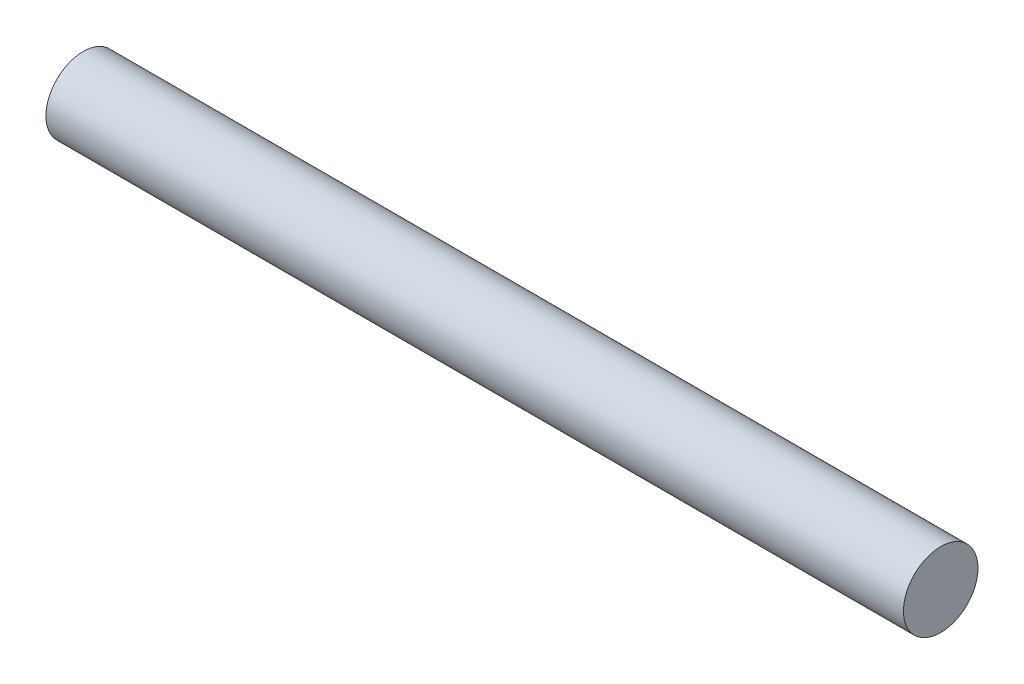
ISO-10303-21;
HEADER;
FILE_DESCRIPTION(('STEP AP214'),'2;1');
FILE_NAME('part.step','',(''),(''),'','','');
FILE_SCHEMA(('AUTOMOTIVE_DESIGN { 1 0 10303 214 1 1 1 1 }'));
ENDSEC;
DATA;
#1=APPLICATION_CONTEXT('core data for automotive mechanical design processes');
#2=APPLICATION_PROTOCOL_DEFINITION('international standard','automotive_design',2000,#1);
#3=PRODUCT_CONTEXT('',#1,'mechanical');
#4=PRODUCT('Part','Part','',(#3));
#5=PRODUCT_RELATED_PRODUCT_CATEGORY('part','',(#4));
#6=PRODUCT_DEFINITION_FORMATION('','',#4);
#7=PRODUCT_DEFINITION_CONTEXT('part definition',#1,'design');
#8=PRODUCT_DEFINITION('design','',#6,#7);
#9=PRODUCT_DEFINITION_SHAPE('','',#8);
#10=(LENGTH_UNIT() NAMED_UNIT(*) SI_UNIT(.MILLI.,.METRE.));
#11=(NAMED_UNIT(*) PLANE_ANGLE_UNIT() SI_UNIT($,.RADIAN.));
#12=(NAMED_UNIT(*) SI_UNIT($,.STERADIAN.) SOLID_ANGLE_UNIT());
#13=UNCERTAINTY_MEASURE_WITH_UNIT(LENGTH_MEASURE(1.E-05),#10,'distance_accuracy_value','');
#14=(GEOMETRIC_REPRESENTATION_CONTEXT(3) GLOBAL_UNCERTAINTY_ASSIGNED_CONTEXT((#13)) GLOBAL_UNIT_ASSIGNED_CONTEXT((#10,
#11,#12)) REPRESENTATION_CONTEXT('',''));
#15=CARTESIAN_POINT('',(0.,0.,0.));
#16=DIRECTION('',(0.,0.,1.));
#17=DIRECTION('',(1.,0.,0.));
#18=AXIS2_PLACEMENT_3D('',#15,#16,#17);
#19=CARTESIAN_POINT('',(23.,0.,0.));
#20=DIRECTION('',(-1.,0.,0.));
#21=DIRECTION('',(0.,0.,1.));
#22=AXIS2_PLACEMENT_3D('',#19,#20,#21);
#23=CYLINDRICAL_SURFACE('',#22,1.);
#24=CARTESIAN_POINT('',(23.,0.,0.));
#25=DIRECTION('',(1.,0.,0.));
#26=DIRECTION('',(0.,0.,-1.));
#27=AXIS2_PLACEMENT_3D('',#24,#25,#26);
#28=CIRCLE('',#27,1.);
#29=CARTESIAN_POINT('',(23.,0.,-1.));
#30=VERTEX_POINT('',#29);
#31=EDGE_CURVE('E10',#30,#30,#28,.T.);
#32=ORIENTED_EDGE('',*,*,#31,.F.);
#33=EDGE_LOOP('',(#32));
#34=FACE_BOUND('',#33,.T.);
#35=CARTESIAN_POINT('',(0.,0.,0.));
#36=DIRECTION('',(1.,0.,0.));
#37=DIRECTION('',(0.,0.,-1.));
#38=AXIS2_PLACEMENT_3D('',#35,#36,#37);
#39=CIRCLE('',#38,1.);
#40=CARTESIAN_POINT('',(0.,0.,-1.));
#41=VERTEX_POINT('',#40);
#42=EDGE_CURVE('E44',#41,#41,#39,.T.);
#43=ORIENTED_EDGE('',*,*,#42,.T.);
#44=EDGE_LOOP('',(#43));
#45=FACE_BOUND('',#44,.T.);
#46=ADVANCED_FACE('F41',(#34,#45),#23,.T.);
#47=CARTESIAN_POINT('',(23.,0.,0.));
#48=DIRECTION('',(1.,0.,0.));
#49=DIRECTION('',(0.,0.,-1.));
#50=AXIS2_PLACEMENT_3D('',#47,#48,#49);
#51=PLANE('',#50);
#52=ORIENTED_EDGE('',*,*,#31,.T.);
#53=EDGE_LOOP('',(#52));
#54=FACE_BOUND('',#53,.T.);
#55=ADVANCED_FACE('F56',(#54),#51,.T.);
#56=CARTESIAN_POINT('',(0.,0.,0.));
#57=DIRECTION('',(1.,0.,0.));
#58=DIRECTION('',(0.,0.,-1.));
#59=AXIS2_PLACEMENT_3D('',#56,#57,#58);
#60=PLANE('',#59);
#61=ORIENTED_EDGE('',*,*,#42,.F.);
#62=EDGE_LOOP('',(#61));
#63=FACE_BOUND('',#62,.T.);
#64=ADVANCED_FACE('F54',(#63),#60,.F.);
#65=CLOSED_SHELL('',(#46,#55,#64));
#66=MANIFOLD_SOLID_BREP('B2',#65);
#67=ADVANCED_BREP_SHAPE_REPRESENTATION('',(#18,#66),#14);
#68=SHAPE_DEFINITION_REPRESENTATION(#9,#67);
ENDSEC;
END-ISO-10303-21;
